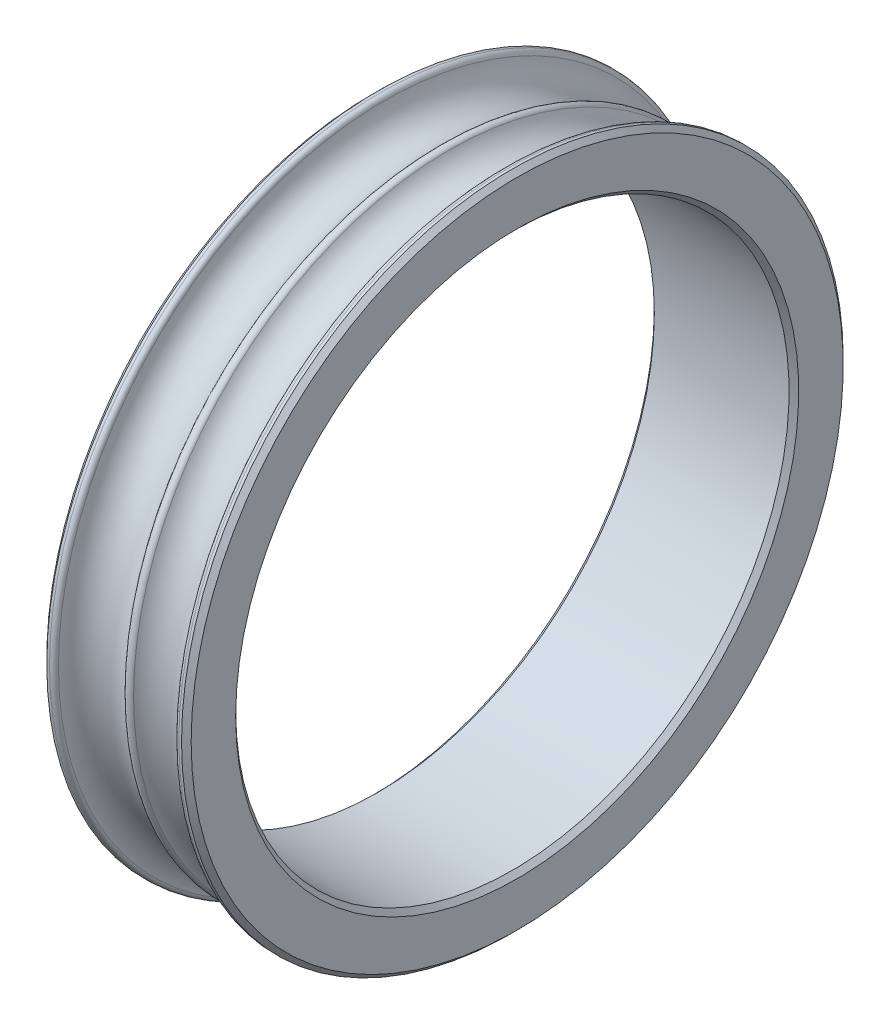
ISO-10303-21;
HEADER;
FILE_DESCRIPTION(('STEP AP214'),'2;1');
FILE_NAME('part.step','',(''),(''),'','','');
FILE_SCHEMA(('AUTOMOTIVE_DESIGN { 1 0 10303 214 1 1 1 1 }'));
ENDSEC;
DATA;
#1=APPLICATION_CONTEXT('core data for automotive mechanical design processes');
#2=APPLICATION_PROTOCOL_DEFINITION('international standard','automotive_design',2000,#1);
#3=PRODUCT_CONTEXT('',#1,'mechanical');
#4=PRODUCT('Part','Part','',(#3));
#5=PRODUCT_RELATED_PRODUCT_CATEGORY('part','',(#4));
#6=PRODUCT_DEFINITION_FORMATION('','',#4);
#7=PRODUCT_DEFINITION_CONTEXT('part definition',#1,'design');
#8=PRODUCT_DEFINITION('design','',#6,#7);
#9=PRODUCT_DEFINITION_SHAPE('','',#8);
#10=(LENGTH_UNIT() NAMED_UNIT(*) SI_UNIT(.MILLI.,.METRE.));
#11=(NAMED_UNIT(*) PLANE_ANGLE_UNIT() SI_UNIT($,.RADIAN.));
#12=(NAMED_UNIT(*) SI_UNIT($,.STERADIAN.) SOLID_ANGLE_UNIT());
#13=UNCERTAINTY_MEASURE_WITH_UNIT(LENGTH_MEASURE(1.E-05),#10,'distance_accuracy_value','');
#14=(GEOMETRIC_REPRESENTATION_CONTEXT(3) GLOBAL_UNCERTAINTY_ASSIGNED_CONTEXT((#13)) GLOBAL_UNIT_ASSIGNED_CONTEXT((#10,
#11,#12)) REPRESENTATION_CONTEXT('',''));
#15=CARTESIAN_POINT('',(0.,0.,0.));
#16=DIRECTION('',(0.,0.,1.));
#17=DIRECTION('',(1.,0.,0.));
#18=AXIS2_PLACEMENT_3D('',#15,#16,#17);
#19=CARTESIAN_POINT('',(2.5,0.,0.));
#20=DIRECTION('',(-1.,0.,0.));
#21=DIRECTION('',(0.,0.,1.));
#22=AXIS2_PLACEMENT_3D('',#19,#20,#21);
#23=TOROIDAL_SURFACE('',#22,27.5,2.5);
#24=CARTESIAN_POINT('',(4.97610458902581,0.,0.));
#25=DIRECTION('',(-1.,0.,0.));
#26=DIRECTION('',(0.,0.,1.));
#27=AXIS2_PLACEMENT_3D('',#24,#25,#26);
#28=CIRCLE('',#27,27.155172413793);
#29=CARTESIAN_POINT('',(4.97610458902581,0.,27.155172413793));
#30=VERTEX_POINT('',#29);
#31=EDGE_CURVE('E84',#30,#30,#28,.T.);
#32=ORIENTED_EDGE('',*,*,#31,.T.);
#33=EDGE_LOOP('',(#32));
#34=FACE_BOUND('',#33,.T.);
#35=CARTESIAN_POINT('',(0.344827586206885,0.,0.));
#36=DIRECTION('',(1.,0.,0.));
#37=DIRECTION('',(0.,0.,-1.));
#38=AXIS2_PLACEMENT_3D('',#35,#36,#37);
#39=CIRCLE('',#38,26.2330225468363);
#40=CARTESIAN_POINT('',(0.344827586206885,0.,-26.2330225468363));
#41=VERTEX_POINT('',#40);
#42=EDGE_CURVE('E88',#41,#41,#39,.T.);
#43=ORIENTED_EDGE('',*,*,#42,.T.);
#44=EDGE_LOOP('',(#43));
#45=FACE_BOUND('',#44,.T.);
#46=ADVANCED_FACE('F39',(#34,#45),#23,.F.);
#47=CARTESIAN_POINT('',(-2.5,0.,0.));
#48=DIRECTION('',(-1.,0.,0.));
#49=DIRECTION('',(0.,0.,1.));
#50=AXIS2_PLACEMENT_3D('',#47,#48,#49);
#51=TOROIDAL_SURFACE('',#50,27.5,2.5);
#52=CARTESIAN_POINT('',(-4.97610458902581,0.,0.));
#53=DIRECTION('',(1.,0.,0.));
#54=DIRECTION('',(0.,0.,-1.));
#55=AXIS2_PLACEMENT_3D('',#52,#53,#54);
#56=CIRCLE('',#55,27.155172413793);
#57=CARTESIAN_POINT('',(-4.97610458902581,0.,-27.155172413793));
#58=VERTEX_POINT('',#57);
#59=EDGE_CURVE('E92',#58,#58,#56,.T.);
#60=ORIENTED_EDGE('',*,*,#59,.T.);
#61=EDGE_LOOP('',(#60));
#62=FACE_BOUND('',#61,.T.);
#63=CARTESIAN_POINT('',(-0.344827586206884,0.,0.));
#64=DIRECTION('',(-1.,0.,0.));
#65=DIRECTION('',(0.,0.,1.));
#66=AXIS2_PLACEMENT_3D('',#63,#64,#65);
#67=CIRCLE('',#66,26.2330225468363);
#68=CARTESIAN_POINT('',(-0.344827586206884,0.,26.2330225468363));
#69=VERTEX_POINT('',#68);
#70=EDGE_CURVE('E96',#69,#69,#67,.T.);
#71=ORIENTED_EDGE('',*,*,#70,.T.);
#72=EDGE_LOOP('',(#71));
#73=FACE_BOUND('',#72,.T.);
#74=ADVANCED_FACE('F126',(#62,#73),#51,.F.);
#75=CARTESIAN_POINT('',(-16.5806488145554,0.,0.));
#76=DIRECTION('',(-1.,0.,0.));
#77=DIRECTION('',(0.,0.,1.));
#78=AXIS2_PLACEMENT_3D('',#75,#76,#77);
#79=CYLINDRICAL_SURFACE('',#78,27.5);
#80=CARTESIAN_POINT('',(-5.60000000000001,0.,0.));
#81=DIRECTION('',(1.,0.,0.));
#82=DIRECTION('',(0.,0.,-1.));
#83=AXIS2_PLACEMENT_3D('',#80,#81,#82);
#84=CIRCLE('',#83,27.5);
#85=CARTESIAN_POINT('',(-5.60000000000001,0.,-27.5));
#86=VERTEX_POINT('',#85);
#87=EDGE_CURVE('E10',#86,#86,#84,.T.);
#88=ORIENTED_EDGE('',*,*,#87,.T.);
#89=EDGE_LOOP('',(#88));
#90=FACE_BOUND('',#89,.T.);
#91=CARTESIAN_POINT('',(-5.37228132326901,0.,0.));
#92=DIRECTION('',(1.,0.,0.));
#93=DIRECTION('',(0.,0.,-1.));
#94=AXIS2_PLACEMENT_3D('',#91,#92,#93);
#95=CIRCLE('',#94,27.5);
#96=CARTESIAN_POINT('',(-5.37228132326901,0.,-27.5));
#97=VERTEX_POINT('',#96);
#98=EDGE_CURVE('E100',#97,#97,#95,.F.);
#99=ORIENTED_EDGE('',*,*,#98,.T.);
#100=EDGE_LOOP('',(#99));
#101=FACE_BOUND('',#100,.T.);
#102=ADVANCED_FACE('F105',(#90,#101),#79,.T.);
#103=CARTESIAN_POINT('',(-6.,27.5,0.));
#104=DIRECTION('',(1.,0.,0.));
#105=DIRECTION('',(0.,0.,-1.));
#106=AXIS2_PLACEMENT_3D('',#103,#104,#105);
#107=PLANE('',#106);
#108=CARTESIAN_POINT('',(-6.,0.,0.));
#109=DIRECTION('',(1.,0.,0.));
#110=DIRECTION('',(0.,0.,-1.));
#111=AXIS2_PLACEMENT_3D('',#108,#109,#110);
#112=CIRCLE('',#111,27.1);
#113=CARTESIAN_POINT('',(-6.,0.,-27.1));
#114=VERTEX_POINT('',#113);
#115=EDGE_CURVE('E48',#114,#114,#112,.F.);
#116=ORIENTED_EDGE('',*,*,#115,.T.);
#117=EDGE_LOOP('',(#116));
#118=FACE_BOUND('',#117,.T.);
#119=CARTESIAN_POINT('',(-6.,0.,0.));
#120=DIRECTION('',(1.,0.,0.));
#121=DIRECTION('',(0.,0.,-1.));
#122=AXIS2_PLACEMENT_3D('',#119,#120,#121);
#123=CIRCLE('',#122,23.4);
#124=CARTESIAN_POINT('',(-6.,0.,-23.4));
#125=VERTEX_POINT('',#124);
#126=EDGE_CURVE('E53',#125,#125,#123,.T.);
#127=ORIENTED_EDGE('',*,*,#126,.T.);
#128=EDGE_LOOP('',(#127));
#129=FACE_BOUND('',#128,.T.);
#130=ADVANCED_FACE('F137',(#118,#129),#107,.F.);
#131=CARTESIAN_POINT('',(-16.5806488145554,0.,0.));
#132=DIRECTION('',(-1.,0.,0.));
#133=DIRECTION('',(0.,0.,1.));
#134=AXIS2_PLACEMENT_3D('',#131,#132,#133);
#135=CYLINDRICAL_SURFACE('',#134,23.);
#136=CARTESIAN_POINT('',(5.60000000000001,0.,0.));
#137=DIRECTION('',(-1.,0.,0.));
#138=DIRECTION('',(0.,0.,1.));
#139=AXIS2_PLACEMENT_3D('',#136,#137,#138);
#140=CIRCLE('',#139,23.);
#141=CARTESIAN_POINT('',(5.60000000000001,0.,23.));
#142=VERTEX_POINT('',#141);
#143=EDGE_CURVE('E64',#142,#142,#140,.F.);
#144=ORIENTED_EDGE('',*,*,#143,.T.);
#145=EDGE_LOOP('',(#144));
#146=FACE_BOUND('',#145,.T.);
#147=CARTESIAN_POINT('',(-5.60000000000002,0.,0.));
#148=DIRECTION('',(1.,0.,0.));
#149=DIRECTION('',(0.,0.,-1.));
#150=AXIS2_PLACEMENT_3D('',#147,#148,#149);
#151=CIRCLE('',#150,23.);
#152=CARTESIAN_POINT('',(-5.60000000000002,0.,-23.));
#153=VERTEX_POINT('',#152);
#154=EDGE_CURVE('E68',#153,#153,#151,.F.);
#155=ORIENTED_EDGE('',*,*,#154,.T.);
#156=EDGE_LOOP('',(#155));
#157=FACE_BOUND('',#156,.T.);
#158=ADVANCED_FACE('F140',(#146,#157),#135,.F.);
#159=CARTESIAN_POINT('',(6.,27.5,0.));
#160=DIRECTION('',(-1.,0.,0.));
#161=DIRECTION('',(0.,0.,1.));
#162=AXIS2_PLACEMENT_3D('',#159,#160,#161);
#163=PLANE('',#162);
#164=CARTESIAN_POINT('',(6.,0.,0.));
#165=DIRECTION('',(-1.,0.,0.));
#166=DIRECTION('',(0.,0.,1.));
#167=AXIS2_PLACEMENT_3D('',#164,#165,#166);
#168=CIRCLE('',#167,23.4);
#169=CARTESIAN_POINT('',(6.,0.,23.4));
#170=VERTEX_POINT('',#169);
#171=EDGE_CURVE('E72',#170,#170,#168,.T.);
#172=ORIENTED_EDGE('',*,*,#171,.T.);
#173=EDGE_LOOP('',(#172));
#174=FACE_BOUND('',#173,.T.);
#175=CARTESIAN_POINT('',(6.,0.,0.));
#176=DIRECTION('',(-1.,0.,0.));
#177=DIRECTION('',(0.,0.,1.));
#178=AXIS2_PLACEMENT_3D('',#175,#176,#177);
#179=CIRCLE('',#178,27.1);
#180=CARTESIAN_POINT('',(6.,0.,27.1));
#181=VERTEX_POINT('',#180);
#182=EDGE_CURVE('E76',#181,#181,#179,.F.);
#183=ORIENTED_EDGE('',*,*,#182,.T.);
#184=EDGE_LOOP('',(#183));
#185=FACE_BOUND('',#184,.T.);
#186=ADVANCED_FACE('F120',(#174,#185),#163,.F.);
#187=CARTESIAN_POINT('',(-16.5806488145554,0.,0.));
#188=DIRECTION('',(-1.,0.,0.));
#189=DIRECTION('',(0.,0.,1.));
#190=AXIS2_PLACEMENT_3D('',#187,#188,#189);
#191=CYLINDRICAL_SURFACE('',#190,27.5);
#192=CARTESIAN_POINT('',(5.60000000000001,0.,0.));
#193=DIRECTION('',(-1.,0.,0.));
#194=DIRECTION('',(0.,0.,1.));
#195=AXIS2_PLACEMENT_3D('',#192,#193,#194);
#196=CIRCLE('',#195,27.5);
#197=CARTESIAN_POINT('',(5.60000000000002,0.,27.5));
#198=VERTEX_POINT('',#197);
#199=EDGE_CURVE('E58',#198,#198,#196,.T.);
#200=ORIENTED_EDGE('',*,*,#199,.T.);
#201=EDGE_LOOP('',(#200));
#202=FACE_BOUND('',#201,.T.);
#203=CARTESIAN_POINT('',(5.37228132326902,0.,0.));
#204=DIRECTION('',(1.,0.,0.));
#205=DIRECTION('',(0.,0.,-1.));
#206=AXIS2_PLACEMENT_3D('',#203,#204,#205);
#207=CIRCLE('',#206,27.5);
#208=CARTESIAN_POINT('',(5.37228132326902,0.,-27.5));
#209=VERTEX_POINT('',#208);
#210=EDGE_CURVE('E80',#209,#209,#207,.T.);
#211=ORIENTED_EDGE('',*,*,#210,.T.);
#212=EDGE_LOOP('',(#211));
#213=FACE_BOUND('',#212,.T.);
#214=ADVANCED_FACE('F110',(#202,#213),#191,.T.);
#215=CARTESIAN_POINT('',(-5.37228132326901,0.,0.));
#216=DIRECTION('',(1.,0.,0.));
#217=DIRECTION('',(0.,0.,-1.));
#218=AXIS2_PLACEMENT_3D('',#215,#216,#217);
#219=TOROIDAL_SURFACE('',#218,27.1,0.4);
#220=ORIENTED_EDGE('',*,*,#59,.F.);
#221=EDGE_LOOP('',(#220));
#222=FACE_BOUND('',#221,.T.);
#223=ORIENTED_EDGE('',*,*,#98,.F.);
#224=EDGE_LOOP('',(#223));
#225=FACE_BOUND('',#224,.T.);
#226=ADVANCED_FACE('F107',(#222,#225),#219,.T.);
#227=CARTESIAN_POINT('',(5.37228132326901,0.,0.));
#228=DIRECTION('',(1.,0.,0.));
#229=DIRECTION('',(0.,0.,-1.));
#230=AXIS2_PLACEMENT_3D('',#227,#228,#229);
#231=TOROIDAL_SURFACE('',#230,27.1,0.4);
#232=ORIENTED_EDGE('',*,*,#210,.F.);
#233=EDGE_LOOP('',(#232));
#234=FACE_BOUND('',#233,.T.);
#235=ORIENTED_EDGE('',*,*,#31,.F.);
#236=EDGE_LOOP('',(#235));
#237=FACE_BOUND('',#236,.T.);
#238=ADVANCED_FACE('F109',(#234,#237),#231,.T.);
#239=CARTESIAN_POINT('',(0.,0.,0.));
#240=DIRECTION('',(1.,0.,0.));
#241=DIRECTION('',(0.,0.,-1.));
#242=AXIS2_PLACEMENT_3D('',#239,#240,#241);
#243=TOROIDAL_SURFACE('',#242,26.0303061543301,0.4);
#244=ORIENTED_EDGE('',*,*,#42,.F.);
#245=EDGE_LOOP('',(#244));
#246=FACE_BOUND('',#245,.T.);
#247=ORIENTED_EDGE('',*,*,#70,.F.);
#248=EDGE_LOOP('',(#247));
#249=FACE_BOUND('',#248,.T.);
#250=ADVANCED_FACE('F117',(#246,#249),#243,.T.);
#251=CARTESIAN_POINT('',(6.,0.,0.));
#252=DIRECTION('',(1.,0.,0.));
#253=DIRECTION('',(0.,0.,-1.));
#254=AXIS2_PLACEMENT_3D('',#251,#252,#253);
#255=CONICAL_SURFACE('',#254,23.4,0.785398163397453);
#256=ORIENTED_EDGE('',*,*,#143,.F.);
#257=EDGE_LOOP('',(#256));
#258=FACE_BOUND('',#257,.T.);
#259=ORIENTED_EDGE('',*,*,#171,.F.);
#260=EDGE_LOOP('',(#259));
#261=FACE_BOUND('',#260,.T.);
#262=ADVANCED_FACE('F156',(#258,#261),#255,.F.);
#263=CARTESIAN_POINT('',(5.60000000000001,0.,0.));
#264=DIRECTION('',(-1.,0.,0.));
#265=DIRECTION('',(0.,0.,1.));
#266=AXIS2_PLACEMENT_3D('',#263,#264,#265);
#267=CONICAL_SURFACE('',#266,27.5,0.785398163397466);
#268=CARTESIAN_POINT('',(6.,0.,27.1));
#269=CARTESIAN_POINT('',(5.99583333333333,0.,27.1041666666667));
#270=CARTESIAN_POINT('',(5.99166666666667,0.,27.1083333333333));
#271=CARTESIAN_POINT('',(5.98333333333334,0.,27.1166666666667));
#272=CARTESIAN_POINT('',(5.97916666666667,0.,27.1208333333333));
#273=CARTESIAN_POINT('',(5.97083333333333,0.,27.1291666666667));
#274=CARTESIAN_POINT('',(5.96666666666667,0.,27.1333333333333));
#275=CARTESIAN_POINT('',(5.95833333333334,0.,27.1416666666667));
#276=CARTESIAN_POINT('',(5.95416666666667,0.,27.1458333333333));
#277=CARTESIAN_POINT('',(5.94583333333334,0.,27.1541666666667));
#278=CARTESIAN_POINT('',(5.94166666666667,0.,27.1583333333333));
#279=CARTESIAN_POINT('',(5.93333333333334,0.,27.1666666666667));
#280=CARTESIAN_POINT('',(5.92916666666667,0.,27.1708333333333));
#281=CARTESIAN_POINT('',(5.92083333333334,0.,27.1791666666667));
#282=CARTESIAN_POINT('',(5.91666666666667,0.,27.1833333333333));
#283=CARTESIAN_POINT('',(5.90833333333334,0.,27.1916666666667));
#284=CARTESIAN_POINT('',(5.90416666666667,0.,27.1958333333333));
#285=CARTESIAN_POINT('',(5.89583333333334,0.,27.2041666666667));
#286=CARTESIAN_POINT('',(5.89166666666667,0.,27.2083333333333));
#287=CARTESIAN_POINT('',(5.88333333333334,0.,27.2166666666667));
#288=CARTESIAN_POINT('',(5.87916666666667,0.,27.2208333333333));
#289=CARTESIAN_POINT('',(5.87083333333334,0.,27.2291666666667));
#290=CARTESIAN_POINT('',(5.86666666666667,0.,27.2333333333333));
#291=CARTESIAN_POINT('',(5.85833333333334,0.,27.2416666666667));
#292=CARTESIAN_POINT('',(5.85416666666667,0.,27.2458333333333));
#293=CARTESIAN_POINT('',(5.84583333333334,0.,27.2541666666667));
#294=CARTESIAN_POINT('',(5.84166666666667,0.,27.2583333333333));
#295=CARTESIAN_POINT('',(5.83333333333334,0.,27.2666666666667));
#296=CARTESIAN_POINT('',(5.82916666666667,0.,27.2708333333333));
#297=CARTESIAN_POINT('',(5.82083333333334,0.,27.2791666666667));
#298=CARTESIAN_POINT('',(5.81666666666667,0.,27.2833333333333));
#299=CARTESIAN_POINT('',(5.80833333333334,0.,27.2916666666667));
#300=CARTESIAN_POINT('',(5.80416666666667,0.,27.2958333333333));
#301=CARTESIAN_POINT('',(5.79583333333334,0.,27.3041666666667));
#302=CARTESIAN_POINT('',(5.79166666666668,0.,27.3083333333333));
#303=CARTESIAN_POINT('',(5.78333333333334,0.,27.3166666666667));
#304=CARTESIAN_POINT('',(5.77916666666668,0.,27.3208333333333));
#305=CARTESIAN_POINT('',(5.77083333333334,0.,27.3291666666667));
#306=CARTESIAN_POINT('',(5.76666666666668,0.,27.3333333333333));
#307=CARTESIAN_POINT('',(5.75833333333334,0.,27.3416666666667));
#308=CARTESIAN_POINT('',(5.75416666666668,0.,27.3458333333333));
#309=CARTESIAN_POINT('',(5.74583333333334,0.,27.3541666666667));
#310=CARTESIAN_POINT('',(5.74166666666668,0.,27.3583333333333));
#311=CARTESIAN_POINT('',(5.73333333333334,0.,27.3666666666667));
#312=CARTESIAN_POINT('',(5.72916666666668,0.,27.3708333333333));
#313=CARTESIAN_POINT('',(5.72083333333334,0.,27.3791666666667));
#314=CARTESIAN_POINT('',(5.71666666666668,0.,27.3833333333333));
#315=CARTESIAN_POINT('',(5.70833333333334,0.,27.3916666666667));
#316=CARTESIAN_POINT('',(5.70416666666668,0.,27.3958333333333));
#317=CARTESIAN_POINT('',(5.69583333333335,0.,27.4041666666667));
#318=CARTESIAN_POINT('',(5.69166666666668,0.,27.4083333333333));
#319=CARTESIAN_POINT('',(5.68333333333335,0.,27.4166666666667));
#320=CARTESIAN_POINT('',(5.67916666666668,0.,27.4208333333333));
#321=CARTESIAN_POINT('',(5.67083333333335,0.,27.4291666666667));
#322=CARTESIAN_POINT('',(5.66666666666668,0.,27.4333333333333));
#323=CARTESIAN_POINT('',(5.65833333333335,0.,27.4416666666667));
#324=CARTESIAN_POINT('',(5.65416666666668,0.,27.4458333333333));
#325=CARTESIAN_POINT('',(5.64583333333335,0.,27.4541666666667));
#326=CARTESIAN_POINT('',(5.64166666666668,0.,27.4583333333333));
#327=CARTESIAN_POINT('',(5.63333333333335,0.,27.4666666666667));
#328=CARTESIAN_POINT('',(5.62916666666668,0.,27.4708333333333));
#329=CARTESIAN_POINT('',(5.62083333333335,0.,27.4791666666667));
#330=CARTESIAN_POINT('',(5.61666666666668,0.,27.4833333333333));
#331=CARTESIAN_POINT('',(5.60833333333335,0.,27.4916666666667));
#332=CARTESIAN_POINT('',(5.60416666666668,0.,27.4958333333333));
#333=CARTESIAN_POINT('',(5.60000000000001,0.,27.5));
#334=B_SPLINE_CURVE_WITH_KNOTS('',3,(#268,#269,#270,#271,#272,#273,#274,#275,#276,#277,#278,
#279,#280,#281,#282,#283,#284,#285,#286,#287,#288,#289,#290,#291,#292,#293,#294,#295,#296,#297,
#298,#299,#300,#301,#302,#303,#304,#305,#306,#307,#308,#309,#310,#311,#312,#313,#314,#315,#316,
#317,#318,#319,#320,#321,#322,#323,#324,#325,#326,#327,#328,#329,#330,#331,#332,#333),
.UNSPECIFIED.,.F.,.F.,(4,2,2,2,2,2,2,2,2,2,2,2,2,2,2,2,2,2,2,2,2,2,2,2,2,2,2,2,2,2,2,2,4),(0.,
0.0176776695296648,0.0353553390593272,0.0530330085889895,0.0707106781186543,0.0883883476483167,
0.106066017177982,0.123743686707644,0.141421356237306,0.159099025766971,0.176776695296634,
0.194454364826296,0.212132034355961,0.229809703885623,0.247487373415288,0.265165042944951,
0.282842712474613,0.300520382004278,0.31819805153394,0.335875721063605,0.353553390593267,
0.37123106012293,0.388908729652595,0.406586399182257,0.424264068711922,0.441941738241585,
0.459619407771247,0.477297077300912,0.494974746830574,0.512652416360239,0.530330085889901,
0.548007755419563,0.565685424949229),.UNSPECIFIED.);
#335=EDGE_CURVE('BSEAM152',#181,#198,#334,.T.);
#336=ORIENTED_EDGE('',*,*,#182,.F.);
#337=ORIENTED_EDGE('',*,*,#199,.F.);
#338=ORIENTED_EDGE('',*,*,#335,.T.);
#339=ORIENTED_EDGE('',*,*,#335,.F.);
#340=EDGE_LOOP('',(#336,#338,#337,#339));
#341=FACE_BOUND('',#340,.T.);
#342=ADVANCED_FACE('F152',(#341),#267,.T.);
#343=CARTESIAN_POINT('',(-6.,0.,0.));
#344=DIRECTION('',(1.,0.,0.));
#345=DIRECTION('',(0.,0.,-1.));
#346=AXIS2_PLACEMENT_3D('',#343,#344,#345);
#347=CONICAL_SURFACE('',#346,27.1,0.785398163397461);
#348=ORIENTED_EDGE('',*,*,#87,.F.);
#349=EDGE_LOOP('',(#348));
#350=FACE_BOUND('',#349,.T.);
#351=ORIENTED_EDGE('',*,*,#115,.F.);
#352=EDGE_LOOP('',(#351));
#353=FACE_BOUND('',#352,.T.);
#354=ADVANCED_FACE('F155',(#350,#353),#347,.T.);
#355=CARTESIAN_POINT('',(-5.60000000000002,0.,0.));
#356=DIRECTION('',(-1.,0.,0.));
#357=DIRECTION('',(0.,0.,1.));
#358=AXIS2_PLACEMENT_3D('',#355,#356,#357);
#359=CONICAL_SURFACE('',#358,23.,0.785398163397453);
#360=ORIENTED_EDGE('',*,*,#126,.F.);
#361=EDGE_LOOP('',(#360));
#362=FACE_BOUND('',#361,.T.);
#363=ORIENTED_EDGE('',*,*,#154,.F.);
#364=EDGE_LOOP('',(#363));
#365=FACE_BOUND('',#364,.T.);
#366=ADVANCED_FACE('F42',(#362,#365),#359,.F.);
#367=CLOSED_SHELL('',(#46,#74,#102,#130,#158,#186,#214,#226,#238,#250,#262,#342,#354,#366));
#368=MANIFOLD_SOLID_BREP('B2',#367);
#369=ADVANCED_BREP_SHAPE_REPRESENTATION('',(#18,#368),#14);
#370=SHAPE_DEFINITION_REPRESENTATION(#9,#369);
ENDSEC;
END-ISO-10303-21;
